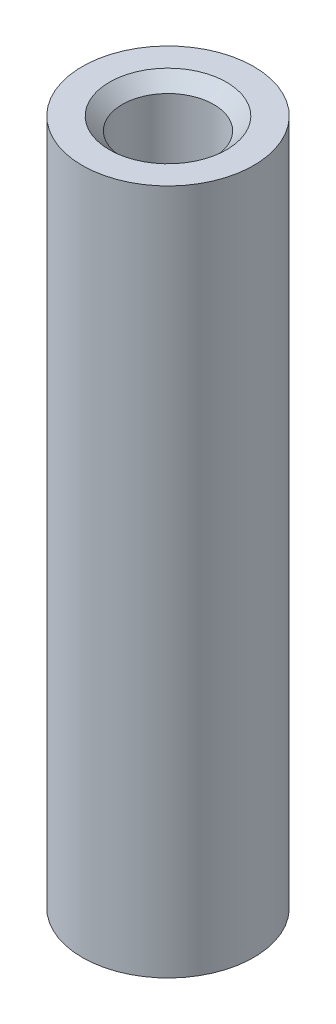
ISO-10303-21;
HEADER;
FILE_DESCRIPTION(('STEP AP214'),'2;1');
FILE_NAME('part.step','',(''),(''),'','','');
FILE_SCHEMA(('AUTOMOTIVE_DESIGN { 1 0 10303 214 1 1 1 1 }'));
ENDSEC;
DATA;
#1=APPLICATION_CONTEXT('core data for automotive mechanical design processes');
#2=APPLICATION_PROTOCOL_DEFINITION('international standard','automotive_design',2000,#1);
#3=PRODUCT_CONTEXT('',#1,'mechanical');
#4=PRODUCT('Part','Part','',(#3));
#5=PRODUCT_RELATED_PRODUCT_CATEGORY('part','',(#4));
#6=PRODUCT_DEFINITION_FORMATION('','',#4);
#7=PRODUCT_DEFINITION_CONTEXT('part definition',#1,'design');
#8=PRODUCT_DEFINITION('design','',#6,#7);
#9=PRODUCT_DEFINITION_SHAPE('','',#8);
#10=(LENGTH_UNIT() NAMED_UNIT(*) SI_UNIT(.MILLI.,.METRE.));
#11=(NAMED_UNIT(*) PLANE_ANGLE_UNIT() SI_UNIT($,.RADIAN.));
#12=(NAMED_UNIT(*) SI_UNIT($,.STERADIAN.) SOLID_ANGLE_UNIT());
#13=UNCERTAINTY_MEASURE_WITH_UNIT(LENGTH_MEASURE(1.E-05),#10,'distance_accuracy_value','');
#14=(GEOMETRIC_REPRESENTATION_CONTEXT(3) GLOBAL_UNCERTAINTY_ASSIGNED_CONTEXT((#13)) GLOBAL_UNIT_ASSIGNED_CONTEXT((#10,
#11,#12)) REPRESENTATION_CONTEXT('',''));
#15=CARTESIAN_POINT('',(0.,0.,0.));
#16=DIRECTION('',(0.,0.,1.));
#17=DIRECTION('',(1.,0.,0.));
#18=AXIS2_PLACEMENT_3D('',#15,#16,#17);
#19=CARTESIAN_POINT('',(0.,12.,0.));
#20=DIRECTION('',(0.,-1.,0.));
#21=DIRECTION('',(0.,0.,-1.));
#22=AXIS2_PLACEMENT_3D('',#19,#20,#21);
#23=CYLINDRICAL_SURFACE('',#22,1.5);
#24=CARTESIAN_POINT('',(0.,12.,0.));
#25=DIRECTION('',(0.,1.,0.));
#26=DIRECTION('',(0.,0.,1.));
#27=AXIS2_PLACEMENT_3D('',#24,#25,#26);
#28=CIRCLE('',#27,1.5);
#29=CARTESIAN_POINT('',(0.,12.,1.5));
#30=VERTEX_POINT('',#29);
#31=EDGE_CURVE('E10',#30,#30,#28,.T.);
#32=ORIENTED_EDGE('',*,*,#31,.F.);
#33=EDGE_LOOP('',(#32));
#34=FACE_BOUND('',#33,.T.);
#35=CARTESIAN_POINT('',(0.,0.,0.));
#36=DIRECTION('',(0.,1.,0.));
#37=DIRECTION('',(0.,0.,1.));
#38=AXIS2_PLACEMENT_3D('',#35,#36,#37);
#39=CIRCLE('',#38,1.5);
#40=CARTESIAN_POINT('',(0.,0.,1.5));
#41=VERTEX_POINT('',#40);
#42=EDGE_CURVE('E41',#41,#41,#39,.T.);
#43=ORIENTED_EDGE('',*,*,#42,.T.);
#44=EDGE_LOOP('',(#43));
#45=FACE_BOUND('',#44,.T.);
#46=ADVANCED_FACE('F34',(#34,#45),#23,.T.);
#47=CARTESIAN_POINT('',(0.,12.,0.));
#48=DIRECTION('',(0.,1.,0.));
#49=DIRECTION('',(0.,0.,1.));
#50=AXIS2_PLACEMENT_3D('',#47,#48,#49);
#51=PLANE('',#50);
#52=CARTESIAN_POINT('',(0.,12.,0.));
#53=DIRECTION('',(0.,1.,0.));
#54=DIRECTION('',(0.,0.,1.));
#55=AXIS2_PLACEMENT_3D('',#52,#53,#54);
#56=CIRCLE('',#55,1.025);
#57=CARTESIAN_POINT('',(0.,12.,1.025));
#58=VERTEX_POINT('',#57);
#59=EDGE_CURVE('E50',#58,#58,#56,.T.);
#60=ORIENTED_EDGE('',*,*,#59,.F.);
#61=EDGE_LOOP('',(#60));
#62=FACE_BOUND('',#61,.T.);
#63=ORIENTED_EDGE('',*,*,#31,.T.);
#64=EDGE_LOOP('',(#63));
#65=FACE_BOUND('',#64,.T.);
#66=ADVANCED_FACE('F56',(#62,#65),#51,.T.);
#67=CARTESIAN_POINT('',(0.,0.,0.));
#68=DIRECTION('',(0.,1.,0.));
#69=DIRECTION('',(0.,0.,1.));
#70=AXIS2_PLACEMENT_3D('',#67,#68,#69);
#71=PLANE('',#70);
#72=CARTESIAN_POINT('',(0.,0.,0.));
#73=DIRECTION('',(0.,1.,0.));
#74=DIRECTION('',(0.,0.,1.));
#75=AXIS2_PLACEMENT_3D('',#72,#73,#74);
#76=CIRCLE('',#75,0.799999999999998);
#77=CARTESIAN_POINT('',(0.,0.,0.799999999999998));
#78=VERTEX_POINT('',#77);
#79=EDGE_CURVE('E37',#78,#78,#76,.T.);
#80=ORIENTED_EDGE('',*,*,#79,.T.);
#81=EDGE_LOOP('',(#80));
#82=FACE_BOUND('',#81,.T.);
#83=ORIENTED_EDGE('',*,*,#42,.F.);
#84=EDGE_LOOP('',(#83));
#85=FACE_BOUND('',#84,.T.);
#86=ADVANCED_FACE('F58',(#82,#85),#71,.F.);
#87=CARTESIAN_POINT('',(0.,12.,0.));
#88=DIRECTION('',(0.,1.,0.));
#89=DIRECTION('',(0.,0.,1.));
#90=AXIS2_PLACEMENT_3D('',#87,#88,#89);
#91=CYLINDRICAL_SURFACE('',#90,0.799999999999998);
#92=CARTESIAN_POINT('',(0.,11.775,0.));
#93=DIRECTION('',(0.,1.,0.));
#94=DIRECTION('',(0.,0.,1.));
#95=AXIS2_PLACEMENT_3D('',#92,#93,#94);
#96=CIRCLE('',#95,0.799999999999999);
#97=CARTESIAN_POINT('',(0.,11.775,0.799999999999999));
#98=VERTEX_POINT('',#97);
#99=EDGE_CURVE('E47',#98,#98,#96,.T.);
#100=ORIENTED_EDGE('',*,*,#99,.T.);
#101=EDGE_LOOP('',(#100));
#102=FACE_BOUND('',#101,.T.);
#103=ORIENTED_EDGE('',*,*,#79,.F.);
#104=EDGE_LOOP('',(#103));
#105=FACE_BOUND('',#104,.T.);
#106=ADVANCED_FACE('F64',(#102,#105),#91,.F.);
#107=CARTESIAN_POINT('',(0.,12.,0.));
#108=DIRECTION('',(0.,1.,0.));
#109=DIRECTION('',(0.,0.,1.));
#110=AXIS2_PLACEMENT_3D('',#107,#108,#109);
#111=CONICAL_SURFACE('',#110,1.025,0.785398163397451);
#112=ORIENTED_EDGE('',*,*,#99,.F.);
#113=EDGE_LOOP('',(#112));
#114=FACE_BOUND('',#113,.T.);
#115=ORIENTED_EDGE('',*,*,#59,.T.);
#116=EDGE_LOOP('',(#115));
#117=FACE_BOUND('',#116,.T.);
#118=ADVANCED_FACE('F54',(#114,#117),#111,.F.);
#119=CLOSED_SHELL('',(#46,#66,#86,#106,#118));
#120=MANIFOLD_SOLID_BREP('B2',#119);
#121=ADVANCED_BREP_SHAPE_REPRESENTATION('',(#18,#120),#14);
#122=SHAPE_DEFINITION_REPRESENTATION(#9,#121);
ENDSEC;
END-ISO-10303-21;
